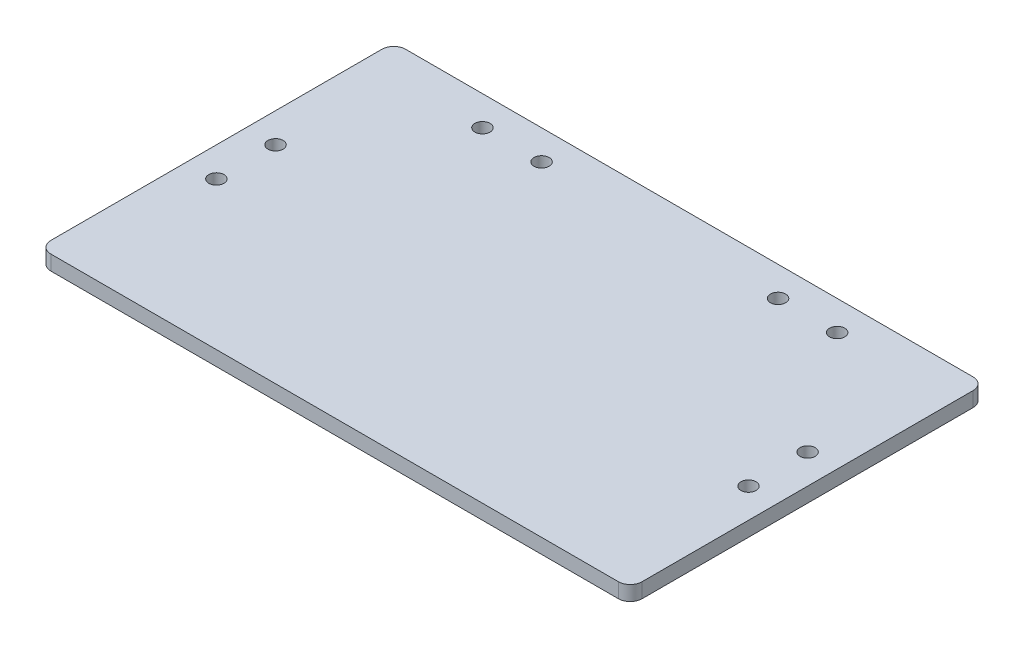
ISO-10303-21;
HEADER;
FILE_DESCRIPTION(('STEP AP214'),'2;1');
FILE_NAME('part.step','',(''),(''),'','','');
FILE_SCHEMA(('AUTOMOTIVE_DESIGN { 1 0 10303 214 1 1 1 1 }'));
ENDSEC;
DATA;
#1=APPLICATION_CONTEXT('core data for automotive mechanical design processes');
#2=APPLICATION_PROTOCOL_DEFINITION('international standard','automotive_design',2000,#1);
#3=PRODUCT_CONTEXT('',#1,'mechanical');
#4=PRODUCT('Part','Part','',(#3));
#5=PRODUCT_RELATED_PRODUCT_CATEGORY('part','',(#4));
#6=PRODUCT_DEFINITION_FORMATION('','',#4);
#7=PRODUCT_DEFINITION_CONTEXT('part definition',#1,'design');
#8=PRODUCT_DEFINITION('design','',#6,#7);
#9=PRODUCT_DEFINITION_SHAPE('','',#8);
#10=(LENGTH_UNIT() NAMED_UNIT(*) SI_UNIT(.MILLI.,.METRE.));
#11=(NAMED_UNIT(*) PLANE_ANGLE_UNIT() SI_UNIT($,.RADIAN.));
#12=(NAMED_UNIT(*) SI_UNIT($,.STERADIAN.) SOLID_ANGLE_UNIT());
#13=UNCERTAINTY_MEASURE_WITH_UNIT(LENGTH_MEASURE(1.E-05),#10,'distance_accuracy_value','');
#14=(GEOMETRIC_REPRESENTATION_CONTEXT(3) GLOBAL_UNCERTAINTY_ASSIGNED_CONTEXT((#13)) GLOBAL_UNIT_ASSIGNED_CONTEXT((#10,
#11,#12)) REPRESENTATION_CONTEXT('',''));
#15=CARTESIAN_POINT('',(0.,0.,0.));
#16=DIRECTION('',(0.,0.,1.));
#17=DIRECTION('',(1.,0.,0.));
#18=AXIS2_PLACEMENT_3D('',#15,#16,#17);
#19=CARTESIAN_POINT('',(127.,6.35,-76.2));
#20=DIRECTION('',(-1.,0.,0.));
#21=DIRECTION('',(0.,0.,1.));
#22=AXIS2_PLACEMENT_3D('',#19,#20,#21);
#23=PLANE('',#22);
#24=DIRECTION('',(0.,0.,-1.));
#25=VECTOR('',#24,1.);
#26=CARTESIAN_POINT('',(127.,6.35,-76.2));
#27=LINE('',#26,#25);
#28=CARTESIAN_POINT('',(127.,6.35,71.1199999999999));
#29=VERTEX_POINT('',#28);
#30=CARTESIAN_POINT('',(127.,6.35,-71.12));
#31=VERTEX_POINT('',#30);
#32=EDGE_CURVE('E124',#29,#31,#27,.T.);
#33=ORIENTED_EDGE('',*,*,#32,.F.);
#34=DIRECTION('',(0.,-1.,0.));
#35=VECTOR('',#34,1.);
#36=CARTESIAN_POINT('',(127.,6.35,71.12));
#37=LINE('',#36,#35);
#38=CARTESIAN_POINT('',(127.,0.,71.1199999999999));
#39=VERTEX_POINT('',#38);
#40=EDGE_CURVE('E150',#29,#39,#37,.T.);
#41=ORIENTED_EDGE('',*,*,#40,.T.);
#42=DIRECTION('',(0.,0.,-1.));
#43=VECTOR('',#42,1.);
#44=CARTESIAN_POINT('',(127.,0.,-76.2));
#45=LINE('',#44,#43);
#46=CARTESIAN_POINT('',(127.,0.,-71.12));
#47=VERTEX_POINT('',#46);
#48=EDGE_CURVE('E156',#39,#47,#45,.T.);
#49=ORIENTED_EDGE('',*,*,#48,.T.);
#50=DIRECTION('',(0.,-1.,0.));
#51=VECTOR('',#50,1.);
#52=CARTESIAN_POINT('',(127.,6.35,-71.12));
#53=LINE('',#52,#51);
#54=EDGE_CURVE('E148',#47,#31,#53,.F.);
#55=ORIENTED_EDGE('',*,*,#54,.T.);
#56=EDGE_LOOP('',(#33,#41,#49,#55));
#57=FACE_BOUND('',#56,.T.);
#58=ADVANCED_FACE('F32',(#57),#23,.F.);
#59=CARTESIAN_POINT('',(-127.,6.35,-76.2));
#60=DIRECTION('',(0.,0.,1.));
#61=DIRECTION('',(1.,0.,0.));
#62=AXIS2_PLACEMENT_3D('',#59,#60,#61);
#63=PLANE('',#62);
#64=DIRECTION('',(-1.,0.,0.));
#65=VECTOR('',#64,1.);
#66=CARTESIAN_POINT('',(-127.,6.35,-76.2));
#67=LINE('',#66,#65);
#68=CARTESIAN_POINT('',(121.92,6.35,-76.2));
#69=VERTEX_POINT('',#68);
#70=CARTESIAN_POINT('',(-121.92,6.35,-76.2));
#71=VERTEX_POINT('',#70);
#72=EDGE_CURVE('E127',#69,#71,#67,.T.);
#73=ORIENTED_EDGE('',*,*,#72,.F.);
#74=DIRECTION('',(0.,-1.,0.));
#75=VECTOR('',#74,1.);
#76=CARTESIAN_POINT('',(121.92,6.35,-76.2));
#77=LINE('',#76,#75);
#78=CARTESIAN_POINT('',(121.92,0.,-76.2));
#79=VERTEX_POINT('',#78);
#80=EDGE_CURVE('E11',#69,#79,#77,.T.);
#81=ORIENTED_EDGE('',*,*,#80,.T.);
#82=DIRECTION('',(-1.,0.,0.));
#83=VECTOR('',#82,1.);
#84=CARTESIAN_POINT('',(-127.,0.,-76.2));
#85=LINE('',#84,#83);
#86=CARTESIAN_POINT('',(-121.92,0.,-76.2));
#87=VERTEX_POINT('',#86);
#88=EDGE_CURVE('E129',#79,#87,#85,.T.);
#89=ORIENTED_EDGE('',*,*,#88,.T.);
#90=DIRECTION('',(0.,-1.,0.));
#91=VECTOR('',#90,1.);
#92=CARTESIAN_POINT('',(-121.92,6.35,-76.2));
#93=LINE('',#92,#91);
#94=EDGE_CURVE('E40',#87,#71,#93,.F.);
#95=ORIENTED_EDGE('',*,*,#94,.T.);
#96=EDGE_LOOP('',(#73,#81,#89,#95));
#97=FACE_BOUND('',#96,.T.);
#98=ADVANCED_FACE('F249',(#97),#63,.F.);
#99=CARTESIAN_POINT('',(-127.,6.35,-76.2));
#100=DIRECTION('',(1.,0.,0.));
#101=DIRECTION('',(0.,0.,-1.));
#102=AXIS2_PLACEMENT_3D('',#99,#100,#101);
#103=PLANE('',#102);
#104=DIRECTION('',(0.,0.,1.));
#105=VECTOR('',#104,1.);
#106=CARTESIAN_POINT('',(-127.,0.,-76.2));
#107=LINE('',#106,#105);
#108=CARTESIAN_POINT('',(-127.,0.,-71.12));
#109=VERTEX_POINT('',#108);
#110=CARTESIAN_POINT('',(-127.,0.,71.1199999999999));
#111=VERTEX_POINT('',#110);
#112=EDGE_CURVE('E125',#109,#111,#107,.T.);
#113=ORIENTED_EDGE('',*,*,#112,.T.);
#114=DIRECTION('',(0.,-1.,0.));
#115=VECTOR('',#114,1.);
#116=CARTESIAN_POINT('',(-127.,6.35,71.12));
#117=LINE('',#116,#115);
#118=CARTESIAN_POINT('',(-127.,6.35,71.1199999999999));
#119=VERTEX_POINT('',#118);
#120=EDGE_CURVE('E103',#111,#119,#117,.F.);
#121=ORIENTED_EDGE('',*,*,#120,.T.);
#122=DIRECTION('',(0.,0.,1.));
#123=VECTOR('',#122,1.);
#124=CARTESIAN_POINT('',(-127.,6.35,-76.2));
#125=LINE('',#124,#123);
#126=CARTESIAN_POINT('',(-127.,6.35,-71.12));
#127=VERTEX_POINT('',#126);
#128=EDGE_CURVE('E168',#127,#119,#125,.T.);
#129=ORIENTED_EDGE('',*,*,#128,.F.);
#130=DIRECTION('',(0.,-1.,0.));
#131=VECTOR('',#130,1.);
#132=CARTESIAN_POINT('',(-127.,6.35,-71.12));
#133=LINE('',#132,#131);
#134=EDGE_CURVE('E108',#127,#109,#133,.T.);
#135=ORIENTED_EDGE('',*,*,#134,.T.);
#136=EDGE_LOOP('',(#113,#121,#129,#135));
#137=FACE_BOUND('',#136,.T.);
#138=ADVANCED_FACE('F247',(#137),#103,.F.);
#139=CARTESIAN_POINT('',(-127.,6.35,76.2));
#140=DIRECTION('',(0.,0.,-1.));
#141=DIRECTION('',(-1.,0.,0.));
#142=AXIS2_PLACEMENT_3D('',#139,#140,#141);
#143=PLANE('',#142);
#144=DIRECTION('',(1.,0.,0.));
#145=VECTOR('',#144,1.);
#146=CARTESIAN_POINT('',(-127.,6.35,76.2));
#147=LINE('',#146,#145);
#148=CARTESIAN_POINT('',(-121.92,6.35,76.2));
#149=VERTEX_POINT('',#148);
#150=CARTESIAN_POINT('',(121.92,6.35,76.2));
#151=VERTEX_POINT('',#150);
#152=EDGE_CURVE('E118',#149,#151,#147,.T.);
#153=ORIENTED_EDGE('',*,*,#152,.F.);
#154=DIRECTION('',(0.,-1.,0.));
#155=VECTOR('',#154,1.);
#156=CARTESIAN_POINT('',(-121.92,6.35,76.2));
#157=LINE('',#156,#155);
#158=CARTESIAN_POINT('',(-121.92,0.,76.2));
#159=VERTEX_POINT('',#158);
#160=EDGE_CURVE('E102',#149,#159,#157,.T.);
#161=ORIENTED_EDGE('',*,*,#160,.T.);
#162=DIRECTION('',(1.,0.,0.));
#163=VECTOR('',#162,1.);
#164=CARTESIAN_POINT('',(-127.,0.,76.2));
#165=LINE('',#164,#163);
#166=CARTESIAN_POINT('',(121.92,0.,76.2));
#167=VERTEX_POINT('',#166);
#168=EDGE_CURVE('E115',#159,#167,#165,.T.);
#169=ORIENTED_EDGE('',*,*,#168,.T.);
#170=DIRECTION('',(0.,-1.,0.));
#171=VECTOR('',#170,1.);
#172=CARTESIAN_POINT('',(121.92,6.35,76.2));
#173=LINE('',#172,#171);
#174=EDGE_CURVE('E120',#167,#151,#173,.F.);
#175=ORIENTED_EDGE('',*,*,#174,.T.);
#176=EDGE_LOOP('',(#153,#161,#169,#175));
#177=FACE_BOUND('',#176,.T.);
#178=ADVANCED_FACE('F114',(#177),#143,.F.);
#179=CARTESIAN_POINT('',(0.,6.35,0.));
#180=DIRECTION('',(0.,1.,0.));
#181=DIRECTION('',(0.,0.,1.));
#182=AXIS2_PLACEMENT_3D('',#179,#180,#181);
#183=PLANE('',#182);
#184=CARTESIAN_POINT('',(-114.3,6.35,12.7));
#185=DIRECTION('',(0.,1.,0.));
#186=DIRECTION('',(0.,0.,1.));
#187=AXIS2_PLACEMENT_3D('',#184,#185,#186);
#188=CIRCLE('',#187,3.26389999999999);
#189=CARTESIAN_POINT('',(-114.3,6.35,15.9639));
#190=VERTEX_POINT('',#189);
#191=EDGE_CURVE('E211',#190,#190,#188,.T.);
#192=ORIENTED_EDGE('',*,*,#191,.F.);
#193=EDGE_LOOP('',(#192));
#194=FACE_BOUND('',#193,.T.);
#195=CARTESIAN_POINT('',(-76.2,6.35,-63.5));
#196=DIRECTION('',(0.,1.,0.));
#197=DIRECTION('',(0.,0.,1.));
#198=AXIS2_PLACEMENT_3D('',#195,#196,#197);
#199=CIRCLE('',#198,3.26389999999998);
#200=CARTESIAN_POINT('',(-76.2,6.35,-60.2361));
#201=VERTEX_POINT('',#200);
#202=EDGE_CURVE('E205',#201,#201,#199,.T.);
#203=ORIENTED_EDGE('',*,*,#202,.F.);
#204=EDGE_LOOP('',(#203));
#205=FACE_BOUND('',#204,.T.);
#206=CARTESIAN_POINT('',(-50.8,6.35,-63.5));
#207=DIRECTION('',(0.,1.,0.));
#208=DIRECTION('',(0.,0.,1.));
#209=AXIS2_PLACEMENT_3D('',#206,#207,#208);
#210=CIRCLE('',#209,3.2639);
#211=CARTESIAN_POINT('',(-50.8,6.35,-60.2361));
#212=VERTEX_POINT('',#211);
#213=EDGE_CURVE('E199',#212,#212,#210,.T.);
#214=ORIENTED_EDGE('',*,*,#213,.F.);
#215=EDGE_LOOP('',(#214));
#216=FACE_BOUND('',#215,.T.);
#217=CARTESIAN_POINT('',(50.8,6.35,-63.5));
#218=DIRECTION('',(0.,1.,0.));
#219=DIRECTION('',(0.,0.,-1.));
#220=AXIS2_PLACEMENT_3D('',#217,#218,#219);
#221=CIRCLE('',#220,3.2639);
#222=CARTESIAN_POINT('',(50.8,6.35,-66.7639));
#223=VERTEX_POINT('',#222);
#224=EDGE_CURVE('E193',#223,#223,#221,.T.);
#225=ORIENTED_EDGE('',*,*,#224,.F.);
#226=EDGE_LOOP('',(#225));
#227=FACE_BOUND('',#226,.T.);
#228=CARTESIAN_POINT('',(76.2,6.35,-63.5));
#229=DIRECTION('',(0.,1.,0.));
#230=DIRECTION('',(0.,0.,-1.));
#231=AXIS2_PLACEMENT_3D('',#228,#229,#230);
#232=CIRCLE('',#231,3.26389999999998);
#233=CARTESIAN_POINT('',(76.2,6.35,-66.7639));
#234=VERTEX_POINT('',#233);
#235=EDGE_CURVE('E187',#234,#234,#232,.T.);
#236=ORIENTED_EDGE('',*,*,#235,.F.);
#237=EDGE_LOOP('',(#236));
#238=FACE_BOUND('',#237,.T.);
#239=CARTESIAN_POINT('',(114.3,6.35,12.7));
#240=DIRECTION('',(0.,1.,0.));
#241=DIRECTION('',(0.,0.,-1.));
#242=AXIS2_PLACEMENT_3D('',#239,#240,#241);
#243=CIRCLE('',#242,3.26389999999999);
#244=CARTESIAN_POINT('',(114.3,6.35,9.43610000000001));
#245=VERTEX_POINT('',#244);
#246=EDGE_CURVE('E181',#245,#245,#243,.T.);
#247=ORIENTED_EDGE('',*,*,#246,.F.);
#248=EDGE_LOOP('',(#247));
#249=FACE_BOUND('',#248,.T.);
#250=CARTESIAN_POINT('',(114.3,6.35,-12.7));
#251=DIRECTION('',(0.,1.,0.));
#252=DIRECTION('',(0.,0.,-1.));
#253=AXIS2_PLACEMENT_3D('',#250,#251,#252);
#254=CIRCLE('',#253,3.26389999999999);
#255=CARTESIAN_POINT('',(114.3,6.35,-15.9639));
#256=VERTEX_POINT('',#255);
#257=EDGE_CURVE('E175',#256,#256,#254,.T.);
#258=ORIENTED_EDGE('',*,*,#257,.F.);
#259=EDGE_LOOP('',(#258));
#260=FACE_BOUND('',#259,.T.);
#261=CARTESIAN_POINT('',(-114.3,6.35,-12.7));
#262=DIRECTION('',(0.,1.,0.));
#263=DIRECTION('',(0.,0.,1.));
#264=AXIS2_PLACEMENT_3D('',#261,#262,#263);
#265=CIRCLE('',#264,3.26389999999999);
#266=CARTESIAN_POINT('',(-114.3,6.35,-9.43610000000001));
#267=VERTEX_POINT('',#266);
#268=EDGE_CURVE('E164',#267,#267,#265,.T.);
#269=ORIENTED_EDGE('',*,*,#268,.F.);
#270=EDGE_LOOP('',(#269));
#271=FACE_BOUND('',#270,.T.);
#272=ORIENTED_EDGE('',*,*,#128,.T.);
#273=CARTESIAN_POINT('',(-121.92,6.35,71.12));
#274=DIRECTION('',(0.,1.,0.));
#275=DIRECTION('',(0.,0.,1.));
#276=AXIS2_PLACEMENT_3D('',#273,#274,#275);
#277=CIRCLE('',#276,5.08);
#278=EDGE_CURVE('E146',#119,#149,#277,.T.);
#279=ORIENTED_EDGE('',*,*,#278,.T.);
#280=ORIENTED_EDGE('',*,*,#152,.T.);
#281=CARTESIAN_POINT('',(121.92,6.35,71.12));
#282=DIRECTION('',(0.,1.,0.));
#283=DIRECTION('',(0.,0.,1.));
#284=AXIS2_PLACEMENT_3D('',#281,#282,#283);
#285=CIRCLE('',#284,5.08);
#286=EDGE_CURVE('E144',#151,#29,#285,.T.);
#287=ORIENTED_EDGE('',*,*,#286,.T.);
#288=ORIENTED_EDGE('',*,*,#32,.T.);
#289=CARTESIAN_POINT('',(121.92,6.35,-71.12));
#290=DIRECTION('',(0.,1.,0.));
#291=DIRECTION('',(0.,0.,1.));
#292=AXIS2_PLACEMENT_3D('',#289,#290,#291);
#293=CIRCLE('',#292,5.08);
#294=EDGE_CURVE('E53',#31,#69,#293,.T.);
#295=ORIENTED_EDGE('',*,*,#294,.T.);
#296=ORIENTED_EDGE('',*,*,#72,.T.);
#297=CARTESIAN_POINT('',(-121.92,6.35,-71.12));
#298=DIRECTION('',(0.,1.,0.));
#299=DIRECTION('',(0.,0.,1.));
#300=AXIS2_PLACEMENT_3D('',#297,#298,#299);
#301=CIRCLE('',#300,5.08);
#302=EDGE_CURVE('E141',#71,#127,#301,.T.);
#303=ORIENTED_EDGE('',*,*,#302,.T.);
#304=EDGE_LOOP('',(#272,#279,#280,#287,#288,#295,#296,#303));
#305=FACE_BOUND('',#304,.T.);
#306=ADVANCED_FACE('F226',(#194,#205,#216,#227,#238,#249,#260,#271,#305),#183,.T.);
#307=CARTESIAN_POINT('',(0.,0.,0.));
#308=DIRECTION('',(0.,1.,0.));
#309=DIRECTION('',(0.,0.,1.));
#310=AXIS2_PLACEMENT_3D('',#307,#308,#309);
#311=PLANE('',#310);
#312=CARTESIAN_POINT('',(-114.3,0.,12.7));
#313=DIRECTION('',(0.,1.,0.));
#314=DIRECTION('',(0.,0.,1.));
#315=AXIS2_PLACEMENT_3D('',#312,#313,#314);
#316=CIRCLE('',#315,3.26389999999999);
#317=CARTESIAN_POINT('',(-114.3,0.,15.9639));
#318=VERTEX_POINT('',#317);
#319=EDGE_CURVE('E173',#318,#318,#316,.T.);
#320=ORIENTED_EDGE('',*,*,#319,.T.);
#321=EDGE_LOOP('',(#320));
#322=FACE_BOUND('',#321,.T.);
#323=CARTESIAN_POINT('',(-76.2,0.,-63.5));
#324=DIRECTION('',(0.,1.,0.));
#325=DIRECTION('',(0.,0.,1.));
#326=AXIS2_PLACEMENT_3D('',#323,#324,#325);
#327=CIRCLE('',#326,3.26389999999998);
#328=CARTESIAN_POINT('',(-76.2,0.,-60.2361));
#329=VERTEX_POINT('',#328);
#330=EDGE_CURVE('E208',#329,#329,#327,.T.);
#331=ORIENTED_EDGE('',*,*,#330,.T.);
#332=EDGE_LOOP('',(#331));
#333=FACE_BOUND('',#332,.T.);
#334=CARTESIAN_POINT('',(-50.8,0.,-63.5));
#335=DIRECTION('',(0.,1.,0.));
#336=DIRECTION('',(0.,0.,1.));
#337=AXIS2_PLACEMENT_3D('',#334,#335,#336);
#338=CIRCLE('',#337,3.2639);
#339=CARTESIAN_POINT('',(-50.8,0.,-60.2361));
#340=VERTEX_POINT('',#339);
#341=EDGE_CURVE('E202',#340,#340,#338,.T.);
#342=ORIENTED_EDGE('',*,*,#341,.T.);
#343=EDGE_LOOP('',(#342));
#344=FACE_BOUND('',#343,.T.);
#345=CARTESIAN_POINT('',(50.8,0.,-63.5));
#346=DIRECTION('',(0.,1.,0.));
#347=DIRECTION('',(0.,0.,-1.));
#348=AXIS2_PLACEMENT_3D('',#345,#346,#347);
#349=CIRCLE('',#348,3.2639);
#350=CARTESIAN_POINT('',(50.8,0.,-66.7639));
#351=VERTEX_POINT('',#350);
#352=EDGE_CURVE('E196',#351,#351,#349,.T.);
#353=ORIENTED_EDGE('',*,*,#352,.T.);
#354=EDGE_LOOP('',(#353));
#355=FACE_BOUND('',#354,.T.);
#356=CARTESIAN_POINT('',(76.2,0.,-63.5));
#357=DIRECTION('',(0.,1.,0.));
#358=DIRECTION('',(0.,0.,-1.));
#359=AXIS2_PLACEMENT_3D('',#356,#357,#358);
#360=CIRCLE('',#359,3.26389999999998);
#361=CARTESIAN_POINT('',(76.2,0.,-66.7639));
#362=VERTEX_POINT('',#361);
#363=EDGE_CURVE('E190',#362,#362,#360,.T.);
#364=ORIENTED_EDGE('',*,*,#363,.T.);
#365=EDGE_LOOP('',(#364));
#366=FACE_BOUND('',#365,.T.);
#367=CARTESIAN_POINT('',(114.3,0.,12.7));
#368=DIRECTION('',(0.,1.,0.));
#369=DIRECTION('',(0.,0.,-1.));
#370=AXIS2_PLACEMENT_3D('',#367,#368,#369);
#371=CIRCLE('',#370,3.26389999999999);
#372=CARTESIAN_POINT('',(114.3,0.,9.43610000000001));
#373=VERTEX_POINT('',#372);
#374=EDGE_CURVE('E184',#373,#373,#371,.T.);
#375=ORIENTED_EDGE('',*,*,#374,.T.);
#376=EDGE_LOOP('',(#375));
#377=FACE_BOUND('',#376,.T.);
#378=CARTESIAN_POINT('',(114.3,0.,-12.7));
#379=DIRECTION('',(0.,1.,0.));
#380=DIRECTION('',(0.,0.,-1.));
#381=AXIS2_PLACEMENT_3D('',#378,#379,#380);
#382=CIRCLE('',#381,3.26389999999999);
#383=CARTESIAN_POINT('',(114.3,0.,-15.9639));
#384=VERTEX_POINT('',#383);
#385=EDGE_CURVE('E178',#384,#384,#382,.T.);
#386=ORIENTED_EDGE('',*,*,#385,.T.);
#387=EDGE_LOOP('',(#386));
#388=FACE_BOUND('',#387,.T.);
#389=CARTESIAN_POINT('',(-114.3,0.,-12.7));
#390=DIRECTION('',(0.,1.,0.));
#391=DIRECTION('',(0.,0.,1.));
#392=AXIS2_PLACEMENT_3D('',#389,#390,#391);
#393=CIRCLE('',#392,3.26389999999999);
#394=CARTESIAN_POINT('',(-114.3,0.,-9.43610000000001));
#395=VERTEX_POINT('',#394);
#396=EDGE_CURVE('E161',#395,#395,#393,.T.);
#397=ORIENTED_EDGE('',*,*,#396,.T.);
#398=EDGE_LOOP('',(#397));
#399=FACE_BOUND('',#398,.T.);
#400=ORIENTED_EDGE('',*,*,#168,.F.);
#401=CARTESIAN_POINT('',(-121.92,0.,71.12));
#402=DIRECTION('',(0.,1.,0.));
#403=DIRECTION('',(0.,0.,1.));
#404=AXIS2_PLACEMENT_3D('',#401,#402,#403);
#405=CIRCLE('',#404,5.08);
#406=EDGE_CURVE('E98',#159,#111,#405,.F.);
#407=ORIENTED_EDGE('',*,*,#406,.T.);
#408=ORIENTED_EDGE('',*,*,#112,.F.);
#409=CARTESIAN_POINT('',(-121.92,0.,-71.12));
#410=DIRECTION('',(0.,1.,0.));
#411=DIRECTION('',(0.,0.,1.));
#412=AXIS2_PLACEMENT_3D('',#409,#410,#411);
#413=CIRCLE('',#412,5.08);
#414=EDGE_CURVE('E119',#109,#87,#413,.F.);
#415=ORIENTED_EDGE('',*,*,#414,.T.);
#416=ORIENTED_EDGE('',*,*,#88,.F.);
#417=CARTESIAN_POINT('',(121.92,0.,-71.12));
#418=DIRECTION('',(0.,1.,0.));
#419=DIRECTION('',(0.,0.,1.));
#420=AXIS2_PLACEMENT_3D('',#417,#418,#419);
#421=CIRCLE('',#420,5.08);
#422=EDGE_CURVE('E135',#79,#47,#421,.F.);
#423=ORIENTED_EDGE('',*,*,#422,.T.);
#424=ORIENTED_EDGE('',*,*,#48,.F.);
#425=CARTESIAN_POINT('',(121.92,0.,71.12));
#426=DIRECTION('',(0.,1.,0.));
#427=DIRECTION('',(0.,0.,1.));
#428=AXIS2_PLACEMENT_3D('',#425,#426,#427);
#429=CIRCLE('',#428,5.08);
#430=EDGE_CURVE('E109',#39,#167,#429,.F.);
#431=ORIENTED_EDGE('',*,*,#430,.T.);
#432=EDGE_LOOP('',(#400,#407,#408,#415,#416,#423,#424,#431));
#433=FACE_BOUND('',#432,.T.);
#434=ADVANCED_FACE('F122',(#322,#333,#344,#355,#366,#377,#388,#399,#433),#311,.F.);
#435=CARTESIAN_POINT('',(-114.3,0.,-12.7));
#436=DIRECTION('',(0.,1.,0.));
#437=DIRECTION('',(0.,0.,1.));
#438=AXIS2_PLACEMENT_3D('',#435,#436,#437);
#439=CYLINDRICAL_SURFACE('',#438,3.26389999999999);
#440=ORIENTED_EDGE('',*,*,#396,.F.);
#441=EDGE_LOOP('',(#440));
#442=FACE_BOUND('',#441,.T.);
#443=ORIENTED_EDGE('',*,*,#268,.T.);
#444=EDGE_LOOP('',(#443));
#445=FACE_BOUND('',#444,.T.);
#446=ADVANCED_FACE('F273',(#442,#445),#439,.F.);
#447=CARTESIAN_POINT('',(114.3,0.,-12.7));
#448=DIRECTION('',(0.,1.,0.));
#449=DIRECTION('',(0.,0.,1.));
#450=AXIS2_PLACEMENT_3D('',#447,#448,#449);
#451=CYLINDRICAL_SURFACE('',#450,3.26389999999999);
#452=ORIENTED_EDGE('',*,*,#385,.F.);
#453=EDGE_LOOP('',(#452));
#454=FACE_BOUND('',#453,.T.);
#455=ORIENTED_EDGE('',*,*,#257,.T.);
#456=EDGE_LOOP('',(#455));
#457=FACE_BOUND('',#456,.T.);
#458=ADVANCED_FACE('F277',(#454,#457),#451,.F.);
#459=CARTESIAN_POINT('',(114.3,0.,12.7));
#460=DIRECTION('',(0.,1.,0.));
#461=DIRECTION('',(0.,0.,1.));
#462=AXIS2_PLACEMENT_3D('',#459,#460,#461);
#463=CYLINDRICAL_SURFACE('',#462,3.26389999999999);
#464=ORIENTED_EDGE('',*,*,#374,.F.);
#465=EDGE_LOOP('',(#464));
#466=FACE_BOUND('',#465,.T.);
#467=ORIENTED_EDGE('',*,*,#246,.T.);
#468=EDGE_LOOP('',(#467));
#469=FACE_BOUND('',#468,.T.);
#470=ADVANCED_FACE('F281',(#466,#469),#463,.F.);
#471=CARTESIAN_POINT('',(76.2,0.,-63.5));
#472=DIRECTION('',(0.,1.,0.));
#473=DIRECTION('',(0.,0.,1.));
#474=AXIS2_PLACEMENT_3D('',#471,#472,#473);
#475=CYLINDRICAL_SURFACE('',#474,3.26389999999998);
#476=ORIENTED_EDGE('',*,*,#363,.F.);
#477=EDGE_LOOP('',(#476));
#478=FACE_BOUND('',#477,.T.);
#479=ORIENTED_EDGE('',*,*,#235,.T.);
#480=EDGE_LOOP('',(#479));
#481=FACE_BOUND('',#480,.T.);
#482=ADVANCED_FACE('F285',(#478,#481),#475,.F.);
#483=CARTESIAN_POINT('',(50.8,0.,-63.5));
#484=DIRECTION('',(0.,1.,0.));
#485=DIRECTION('',(0.,0.,1.));
#486=AXIS2_PLACEMENT_3D('',#483,#484,#485);
#487=CYLINDRICAL_SURFACE('',#486,3.2639);
#488=ORIENTED_EDGE('',*,*,#352,.F.);
#489=EDGE_LOOP('',(#488));
#490=FACE_BOUND('',#489,.T.);
#491=ORIENTED_EDGE('',*,*,#224,.T.);
#492=EDGE_LOOP('',(#491));
#493=FACE_BOUND('',#492,.T.);
#494=ADVANCED_FACE('F289',(#490,#493),#487,.F.);
#495=CARTESIAN_POINT('',(-50.8,0.,-63.5));
#496=DIRECTION('',(0.,1.,0.));
#497=DIRECTION('',(0.,0.,1.));
#498=AXIS2_PLACEMENT_3D('',#495,#496,#497);
#499=CYLINDRICAL_SURFACE('',#498,3.2639);
#500=ORIENTED_EDGE('',*,*,#341,.F.);
#501=EDGE_LOOP('',(#500));
#502=FACE_BOUND('',#501,.T.);
#503=ORIENTED_EDGE('',*,*,#213,.T.);
#504=EDGE_LOOP('',(#503));
#505=FACE_BOUND('',#504,.T.);
#506=ADVANCED_FACE('F293',(#502,#505),#499,.F.);
#507=CARTESIAN_POINT('',(-76.2,0.,-63.5));
#508=DIRECTION('',(0.,1.,0.));
#509=DIRECTION('',(0.,0.,1.));
#510=AXIS2_PLACEMENT_3D('',#507,#508,#509);
#511=CYLINDRICAL_SURFACE('',#510,3.26389999999998);
#512=ORIENTED_EDGE('',*,*,#330,.F.);
#513=EDGE_LOOP('',(#512));
#514=FACE_BOUND('',#513,.T.);
#515=ORIENTED_EDGE('',*,*,#202,.T.);
#516=EDGE_LOOP('',(#515));
#517=FACE_BOUND('',#516,.T.);
#518=ADVANCED_FACE('F222',(#514,#517),#511,.F.);
#519=CARTESIAN_POINT('',(-114.3,0.,12.7));
#520=DIRECTION('',(0.,1.,0.));
#521=DIRECTION('',(0.,0.,1.));
#522=AXIS2_PLACEMENT_3D('',#519,#520,#521);
#523=CYLINDRICAL_SURFACE('',#522,3.26389999999999);
#524=ORIENTED_EDGE('',*,*,#319,.F.);
#525=EDGE_LOOP('',(#524));
#526=FACE_BOUND('',#525,.T.);
#527=ORIENTED_EDGE('',*,*,#191,.T.);
#528=EDGE_LOOP('',(#527));
#529=FACE_BOUND('',#528,.T.);
#530=ADVANCED_FACE('F219',(#526,#529),#523,.F.);
#531=CARTESIAN_POINT('',(-121.92,6.35,71.12));
#532=DIRECTION('',(0.,-1.,0.));
#533=DIRECTION('',(0.,0.,-1.));
#534=AXIS2_PLACEMENT_3D('',#531,#532,#533);
#535=CYLINDRICAL_SURFACE('',#534,5.08);
#536=ORIENTED_EDGE('',*,*,#278,.F.);
#537=ORIENTED_EDGE('',*,*,#120,.F.);
#538=ORIENTED_EDGE('',*,*,#406,.F.);
#539=ORIENTED_EDGE('',*,*,#160,.F.);
#540=EDGE_LOOP('',(#536,#537,#538,#539));
#541=FACE_BOUND('',#540,.T.);
#542=ADVANCED_FACE('F101',(#541),#535,.T.);
#543=CARTESIAN_POINT('',(121.92,6.35,71.12));
#544=DIRECTION('',(0.,-1.,0.));
#545=DIRECTION('',(0.,0.,-1.));
#546=AXIS2_PLACEMENT_3D('',#543,#544,#545);
#547=CYLINDRICAL_SURFACE('',#546,5.08);
#548=ORIENTED_EDGE('',*,*,#286,.F.);
#549=ORIENTED_EDGE('',*,*,#174,.F.);
#550=ORIENTED_EDGE('',*,*,#430,.F.);
#551=ORIENTED_EDGE('',*,*,#40,.F.);
#552=EDGE_LOOP('',(#548,#549,#550,#551));
#553=FACE_BOUND('',#552,.T.);
#554=ADVANCED_FACE('F253',(#553),#547,.T.);
#555=CARTESIAN_POINT('',(121.92,6.35,-71.12));
#556=DIRECTION('',(0.,-1.,0.));
#557=DIRECTION('',(0.,0.,-1.));
#558=AXIS2_PLACEMENT_3D('',#555,#556,#557);
#559=CYLINDRICAL_SURFACE('',#558,5.08);
#560=ORIENTED_EDGE('',*,*,#294,.F.);
#561=ORIENTED_EDGE('',*,*,#54,.F.);
#562=ORIENTED_EDGE('',*,*,#422,.F.);
#563=ORIENTED_EDGE('',*,*,#80,.F.);
#564=EDGE_LOOP('',(#560,#561,#562,#563));
#565=FACE_BOUND('',#564,.T.);
#566=ADVANCED_FACE('F252',(#565),#559,.T.);
#567=CARTESIAN_POINT('',(-121.92,6.35,-71.12));
#568=DIRECTION('',(0.,-1.,0.));
#569=DIRECTION('',(0.,0.,-1.));
#570=AXIS2_PLACEMENT_3D('',#567,#568,#569);
#571=CYLINDRICAL_SURFACE('',#570,5.08);
#572=ORIENTED_EDGE('',*,*,#302,.F.);
#573=ORIENTED_EDGE('',*,*,#94,.F.);
#574=ORIENTED_EDGE('',*,*,#414,.F.);
#575=ORIENTED_EDGE('',*,*,#134,.F.);
#576=EDGE_LOOP('',(#572,#573,#574,#575));
#577=FACE_BOUND('',#576,.T.);
#578=ADVANCED_FACE('F34',(#577),#571,.T.);
#579=CLOSED_SHELL('',(#58,#98,#138,#178,#306,#434,#446,#458,#470,#482,#494,#506,#518,#530,#542,
#554,#566,#578));
#580=MANIFOLD_SOLID_BREP('B2',#579);
#581=ADVANCED_BREP_SHAPE_REPRESENTATION('',(#18,#580),#14);
#582=SHAPE_DEFINITION_REPRESENTATION(#9,#581);
ENDSEC;
END-ISO-10303-21;
